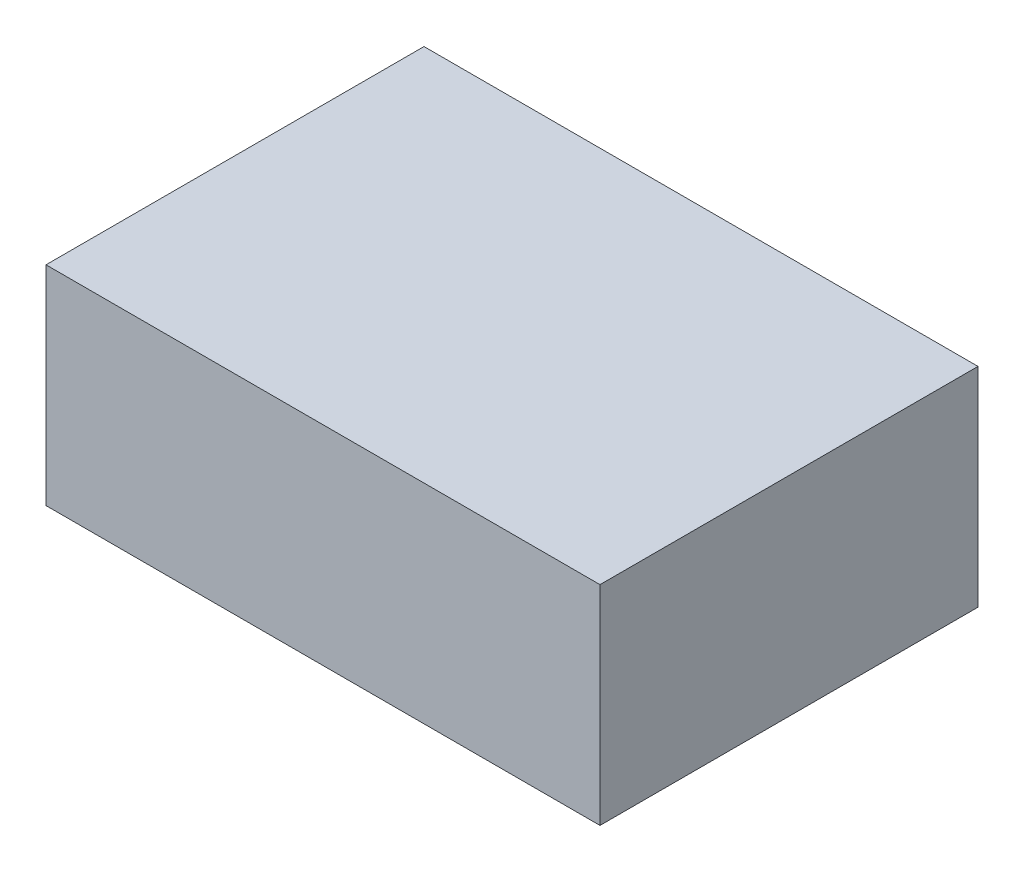
ISO-10303-21;
HEADER;
FILE_DESCRIPTION(('STEP AP214'),'2;1');
FILE_NAME('part.step','',(''),(''),'','','');
FILE_SCHEMA(('AUTOMOTIVE_DESIGN { 1 0 10303 214 1 1 1 1 }'));
ENDSEC;
DATA;
#1=APPLICATION_CONTEXT('core data for automotive mechanical design processes');
#2=APPLICATION_PROTOCOL_DEFINITION('international standard','automotive_design',2000,#1);
#3=PRODUCT_CONTEXT('',#1,'mechanical');
#4=PRODUCT('Part','Part','',(#3));
#5=PRODUCT_RELATED_PRODUCT_CATEGORY('part','',(#4));
#6=PRODUCT_DEFINITION_FORMATION('','',#4);
#7=PRODUCT_DEFINITION_CONTEXT('part definition',#1,'design');
#8=PRODUCT_DEFINITION('design','',#6,#7);
#9=PRODUCT_DEFINITION_SHAPE('','',#8);
#10=(LENGTH_UNIT() NAMED_UNIT(*) SI_UNIT(.MILLI.,.METRE.));
#11=(NAMED_UNIT(*) PLANE_ANGLE_UNIT() SI_UNIT($,.RADIAN.));
#12=(NAMED_UNIT(*) SI_UNIT($,.STERADIAN.) SOLID_ANGLE_UNIT());
#13=UNCERTAINTY_MEASURE_WITH_UNIT(LENGTH_MEASURE(1.E-05),#10,'distance_accuracy_value','');
#14=(GEOMETRIC_REPRESENTATION_CONTEXT(3) GLOBAL_UNCERTAINTY_ASSIGNED_CONTEXT((#13)) GLOBAL_UNIT_ASSIGNED_CONTEXT((#10,
#11,#12)) REPRESENTATION_CONTEXT('',''));
#15=CARTESIAN_POINT('',(0.,0.,0.));
#16=DIRECTION('',(0.,0.,1.));
#17=DIRECTION('',(1.,0.,0.));
#18=AXIS2_PLACEMENT_3D('',#15,#16,#17);
#19=CARTESIAN_POINT('',(0.,32.,-58.));
#20=DIRECTION('',(1.,0.,0.));
#21=DIRECTION('',(0.,0.,-1.));
#22=AXIS2_PLACEMENT_3D('',#19,#20,#21);
#23=PLANE('',#22);
#24=DIRECTION('',(0.,0.,1.));
#25=VECTOR('',#24,1.);
#26=CARTESIAN_POINT('',(0.,0.,-58.));
#27=LINE('',#26,#25);
#28=CARTESIAN_POINT('',(0.,0.,-58.));
#29=VERTEX_POINT('',#28);
#30=CARTESIAN_POINT('',(0.,0.,0.));
#31=VERTEX_POINT('',#30);
#32=EDGE_CURVE('E106',#29,#31,#27,.T.);
#33=ORIENTED_EDGE('',*,*,#32,.T.);
#34=DIRECTION('',(0.,-1.,0.));
#35=VECTOR('',#34,1.);
#36=CARTESIAN_POINT('',(0.,32.,0.));
#37=LINE('',#36,#35);
#38=CARTESIAN_POINT('',(0.,32.,0.));
#39=VERTEX_POINT('',#38);
#40=EDGE_CURVE('E11',#39,#31,#37,.T.);
#41=ORIENTED_EDGE('',*,*,#40,.F.);
#42=DIRECTION('',(0.,0.,1.));
#43=VECTOR('',#42,1.);
#44=CARTESIAN_POINT('',(0.,32.,-58.));
#45=LINE('',#44,#43);
#46=CARTESIAN_POINT('',(0.,32.,-58.));
#47=VERTEX_POINT('',#46);
#48=EDGE_CURVE('E94',#47,#39,#45,.T.);
#49=ORIENTED_EDGE('',*,*,#48,.F.);
#50=DIRECTION('',(0.,-1.,0.));
#51=VECTOR('',#50,1.);
#52=CARTESIAN_POINT('',(0.,32.,-58.));
#53=LINE('',#52,#51);
#54=EDGE_CURVE('E102',#47,#29,#53,.T.);
#55=ORIENTED_EDGE('',*,*,#54,.T.);
#56=EDGE_LOOP('',(#33,#41,#49,#55));
#57=FACE_BOUND('',#56,.T.);
#58=ADVANCED_FACE('F43',(#57),#23,.F.);
#59=CARTESIAN_POINT('',(0.,32.,0.));
#60=DIRECTION('',(0.,0.,-1.));
#61=DIRECTION('',(-1.,0.,0.));
#62=AXIS2_PLACEMENT_3D('',#59,#60,#61);
#63=PLANE('',#62);
#64=DIRECTION('',(1.,0.,0.));
#65=VECTOR('',#64,1.);
#66=CARTESIAN_POINT('',(0.,0.,0.));
#67=LINE('',#66,#65);
#68=CARTESIAN_POINT('',(85.,0.,0.));
#69=VERTEX_POINT('',#68);
#70=EDGE_CURVE('E98',#31,#69,#67,.T.);
#71=ORIENTED_EDGE('',*,*,#70,.T.);
#72=DIRECTION('',(0.,-1.,0.));
#73=VECTOR('',#72,1.);
#74=CARTESIAN_POINT('',(85.,32.,0.));
#75=LINE('',#74,#73);
#76=CARTESIAN_POINT('',(85.,32.,0.));
#77=VERTEX_POINT('',#76);
#78=EDGE_CURVE('E51',#77,#69,#75,.T.);
#79=ORIENTED_EDGE('',*,*,#78,.F.);
#80=DIRECTION('',(1.,0.,0.));
#81=VECTOR('',#80,1.);
#82=CARTESIAN_POINT('',(0.,32.,0.));
#83=LINE('',#82,#81);
#84=EDGE_CURVE('E89',#39,#77,#83,.T.);
#85=ORIENTED_EDGE('',*,*,#84,.F.);
#86=ORIENTED_EDGE('',*,*,#40,.T.);
#87=EDGE_LOOP('',(#71,#79,#85,#86));
#88=FACE_BOUND('',#87,.T.);
#89=ADVANCED_FACE('F97',(#88),#63,.F.);
#90=CARTESIAN_POINT('',(85.,32.,-58.));
#91=DIRECTION('',(-1.,0.,0.));
#92=DIRECTION('',(0.,0.,1.));
#93=AXIS2_PLACEMENT_3D('',#90,#91,#92);
#94=PLANE('',#93);
#95=DIRECTION('',(0.,0.,-1.));
#96=VECTOR('',#95,1.);
#97=CARTESIAN_POINT('',(85.,0.,-58.));
#98=LINE('',#97,#96);
#99=CARTESIAN_POINT('',(85.,0.,-58.));
#100=VERTEX_POINT('',#99);
#101=EDGE_CURVE('E76',#69,#100,#98,.T.);
#102=ORIENTED_EDGE('',*,*,#101,.T.);
#103=DIRECTION('',(0.,-1.,0.));
#104=VECTOR('',#103,1.);
#105=CARTESIAN_POINT('',(85.,32.,-58.));
#106=LINE('',#105,#104);
#107=CARTESIAN_POINT('',(85.,32.,-58.));
#108=VERTEX_POINT('',#107);
#109=EDGE_CURVE('E99',#108,#100,#106,.T.);
#110=ORIENTED_EDGE('',*,*,#109,.F.);
#111=DIRECTION('',(0.,0.,-1.));
#112=VECTOR('',#111,1.);
#113=CARTESIAN_POINT('',(85.,32.,-58.));
#114=LINE('',#113,#112);
#115=EDGE_CURVE('E92',#77,#108,#114,.T.);
#116=ORIENTED_EDGE('',*,*,#115,.F.);
#117=ORIENTED_EDGE('',*,*,#78,.T.);
#118=EDGE_LOOP('',(#102,#110,#116,#117));
#119=FACE_BOUND('',#118,.T.);
#120=ADVANCED_FACE('F100',(#119),#94,.F.);
#121=CARTESIAN_POINT('',(0.,32.,-58.));
#122=DIRECTION('',(0.,0.,1.));
#123=DIRECTION('',(1.,0.,0.));
#124=AXIS2_PLACEMENT_3D('',#121,#122,#123);
#125=PLANE('',#124);
#126=DIRECTION('',(-1.,0.,0.));
#127=VECTOR('',#126,1.);
#128=CARTESIAN_POINT('',(0.,0.,-58.));
#129=LINE('',#128,#127);
#130=EDGE_CURVE('E82',#100,#29,#129,.T.);
#131=ORIENTED_EDGE('',*,*,#130,.T.);
#132=ORIENTED_EDGE('',*,*,#54,.F.);
#133=DIRECTION('',(-1.,0.,0.));
#134=VECTOR('',#133,1.);
#135=CARTESIAN_POINT('',(0.,32.,-58.));
#136=LINE('',#135,#134);
#137=EDGE_CURVE('E59',#108,#47,#136,.T.);
#138=ORIENTED_EDGE('',*,*,#137,.F.);
#139=ORIENTED_EDGE('',*,*,#109,.T.);
#140=EDGE_LOOP('',(#131,#132,#138,#139));
#141=FACE_BOUND('',#140,.T.);
#142=ADVANCED_FACE('F113',(#141),#125,.F.);
#143=CARTESIAN_POINT('',(0.,32.,0.));
#144=DIRECTION('',(0.,1.,0.));
#145=DIRECTION('',(0.,0.,1.));
#146=AXIS2_PLACEMENT_3D('',#143,#144,#145);
#147=PLANE('',#146);
#148=ORIENTED_EDGE('',*,*,#48,.T.);
#149=ORIENTED_EDGE('',*,*,#84,.T.);
#150=ORIENTED_EDGE('',*,*,#115,.T.);
#151=ORIENTED_EDGE('',*,*,#137,.T.);
#152=EDGE_LOOP('',(#148,#149,#150,#151));
#153=FACE_BOUND('',#152,.T.);
#154=ADVANCED_FACE('F90',(#153),#147,.T.);
#155=CARTESIAN_POINT('',(0.,0.,0.));
#156=DIRECTION('',(0.,1.,0.));
#157=DIRECTION('',(0.,0.,1.));
#158=AXIS2_PLACEMENT_3D('',#155,#156,#157);
#159=PLANE('',#158);
#160=ORIENTED_EDGE('',*,*,#32,.F.);
#161=ORIENTED_EDGE('',*,*,#130,.F.);
#162=ORIENTED_EDGE('',*,*,#101,.F.);
#163=ORIENTED_EDGE('',*,*,#70,.F.);
#164=EDGE_LOOP('',(#160,#161,#162,#163));
#165=FACE_BOUND('',#164,.T.);
#166=ADVANCED_FACE('F116',(#165),#159,.F.);
#167=CLOSED_SHELL('',(#58,#89,#120,#142,#154,#166));
#168=MANIFOLD_SOLID_BREP('B2',#167);
#169=ADVANCED_BREP_SHAPE_REPRESENTATION('',(#18,#168),#14);
#170=SHAPE_DEFINITION_REPRESENTATION(#9,#169);
ENDSEC;
END-ISO-10303-21;
